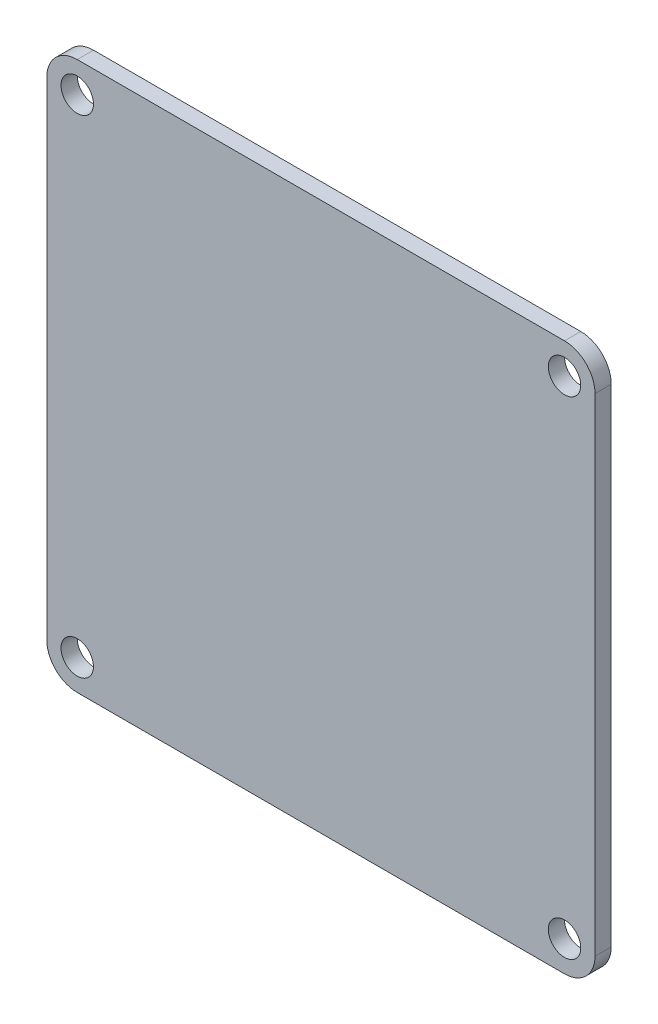
ISO-10303-21;
HEADER;
FILE_DESCRIPTION(('STEP AP214'),'2;1');
FILE_NAME('part.step','',(''),(''),'','','');
FILE_SCHEMA(('AUTOMOTIVE_DESIGN { 1 0 10303 214 1 1 1 1 }'));
ENDSEC;
DATA;
#1=APPLICATION_CONTEXT('core data for automotive mechanical design processes');
#2=APPLICATION_PROTOCOL_DEFINITION('international standard','automotive_design',2000,#1);
#3=PRODUCT_CONTEXT('',#1,'mechanical');
#4=PRODUCT('Part','Part','',(#3));
#5=PRODUCT_RELATED_PRODUCT_CATEGORY('part','',(#4));
#6=PRODUCT_DEFINITION_FORMATION('','',#4);
#7=PRODUCT_DEFINITION_CONTEXT('part definition',#1,'design');
#8=PRODUCT_DEFINITION('design','',#6,#7);
#9=PRODUCT_DEFINITION_SHAPE('','',#8);
#10=(LENGTH_UNIT() NAMED_UNIT(*) SI_UNIT(.MILLI.,.METRE.));
#11=(NAMED_UNIT(*) PLANE_ANGLE_UNIT() SI_UNIT($,.RADIAN.));
#12=(NAMED_UNIT(*) SI_UNIT($,.STERADIAN.) SOLID_ANGLE_UNIT());
#13=UNCERTAINTY_MEASURE_WITH_UNIT(LENGTH_MEASURE(1.E-05),#10,'distance_accuracy_value','');
#14=(GEOMETRIC_REPRESENTATION_CONTEXT(3) GLOBAL_UNCERTAINTY_ASSIGNED_CONTEXT((#13)) GLOBAL_UNIT_ASSIGNED_CONTEXT((#10,
#11,#12)) REPRESENTATION_CONTEXT('',''));
#15=CARTESIAN_POINT('',(0.,0.,0.));
#16=DIRECTION('',(0.,0.,1.));
#17=DIRECTION('',(1.,0.,0.));
#18=AXIS2_PLACEMENT_3D('',#15,#16,#17);
#19=CARTESIAN_POINT('',(30.,30.,2.));
#20=DIRECTION('',(0.,0.,-1.));
#21=DIRECTION('',(-1.,0.,0.));
#22=AXIS2_PLACEMENT_3D('',#19,#20,#21);
#23=CYLINDRICAL_SURFACE('',#22,3.75000000000001);
#24=CARTESIAN_POINT('',(30.,30.,0.));
#25=DIRECTION('',(0.,0.,1.));
#26=DIRECTION('',(1.,0.,0.));
#27=AXIS2_PLACEMENT_3D('',#24,#25,#26);
#28=CIRCLE('',#27,3.75000000000001);
#29=CARTESIAN_POINT('',(30.,33.75,0.));
#30=VERTEX_POINT('',#29);
#31=CARTESIAN_POINT('',(33.75,30.,0.));
#32=VERTEX_POINT('',#31);
#33=EDGE_CURVE('E174',#30,#32,#28,.F.);
#34=ORIENTED_EDGE('',*,*,#33,.F.);
#35=DIRECTION('',(0.,0.,-1.));
#36=VECTOR('',#35,1.);
#37=CARTESIAN_POINT('',(30.,33.75,2.));
#38=LINE('',#37,#36);
#39=CARTESIAN_POINT('',(30.,33.75,2.));
#40=VERTEX_POINT('',#39);
#41=EDGE_CURVE('E11',#40,#30,#38,.T.);
#42=ORIENTED_EDGE('',*,*,#41,.F.);
#43=CARTESIAN_POINT('',(30.,30.,2.));
#44=DIRECTION('',(0.,0.,1.));
#45=DIRECTION('',(1.,0.,0.));
#46=AXIS2_PLACEMENT_3D('',#43,#44,#45);
#47=CIRCLE('',#46,3.75000000000001);
#48=CARTESIAN_POINT('',(33.75,30.,2.));
#49=VERTEX_POINT('',#48);
#50=EDGE_CURVE('E272',#40,#49,#47,.F.);
#51=ORIENTED_EDGE('',*,*,#50,.T.);
#52=DIRECTION('',(0.,0.,-1.));
#53=VECTOR('',#52,1.);
#54=CARTESIAN_POINT('',(33.75,30.,2.));
#55=LINE('',#54,#53);
#56=EDGE_CURVE('E61',#49,#32,#55,.T.);
#57=ORIENTED_EDGE('',*,*,#56,.T.);
#58=EDGE_LOOP('',(#34,#42,#51,#57));
#59=FACE_BOUND('',#58,.T.);
#60=ADVANCED_FACE('F43',(#59),#23,.T.);
#61=CARTESIAN_POINT('',(0.,33.75,2.));
#62=DIRECTION('',(0.,1.,0.));
#63=DIRECTION('',(-1.,0.,0.));
#64=AXIS2_PLACEMENT_3D('',#61,#62,#63);
#65=PLANE('',#64);
#66=DIRECTION('',(1.,0.,0.));
#67=VECTOR('',#66,1.);
#68=CARTESIAN_POINT('',(0.,33.75,0.));
#69=LINE('',#68,#67);
#70=CARTESIAN_POINT('',(-30.,33.75,0.));
#71=VERTEX_POINT('',#70);
#72=EDGE_CURVE('E166',#71,#30,#69,.T.);
#73=ORIENTED_EDGE('',*,*,#72,.F.);
#74=DIRECTION('',(0.,0.,-1.));
#75=VECTOR('',#74,1.);
#76=CARTESIAN_POINT('',(-30.,33.75,2.));
#77=LINE('',#76,#75);
#78=CARTESIAN_POINT('',(-30.,33.75,2.));
#79=VERTEX_POINT('',#78);
#80=EDGE_CURVE('E53',#79,#71,#77,.T.);
#81=ORIENTED_EDGE('',*,*,#80,.F.);
#82=DIRECTION('',(1.,0.,0.));
#83=VECTOR('',#82,1.);
#84=CARTESIAN_POINT('',(0.,33.75,2.));
#85=LINE('',#84,#83);
#86=EDGE_CURVE('E275',#79,#40,#85,.T.);
#87=ORIENTED_EDGE('',*,*,#86,.T.);
#88=ORIENTED_EDGE('',*,*,#41,.T.);
#89=EDGE_LOOP('',(#73,#81,#87,#88));
#90=FACE_BOUND('',#89,.T.);
#91=ADVANCED_FACE('F172',(#90),#65,.T.);
#92=CARTESIAN_POINT('',(-30.,30.,2.));
#93=DIRECTION('',(0.,0.,-1.));
#94=DIRECTION('',(-1.,0.,0.));
#95=AXIS2_PLACEMENT_3D('',#92,#93,#94);
#96=CYLINDRICAL_SURFACE('',#95,3.75000000000002);
#97=CARTESIAN_POINT('',(-30.,30.,0.));
#98=DIRECTION('',(0.,0.,1.));
#99=DIRECTION('',(1.,0.,0.));
#100=AXIS2_PLACEMENT_3D('',#97,#98,#99);
#101=CIRCLE('',#100,3.75000000000002);
#102=CARTESIAN_POINT('',(-33.75,30.,0.));
#103=VERTEX_POINT('',#102);
#104=EDGE_CURVE('E156',#71,#103,#101,.T.);
#105=ORIENTED_EDGE('',*,*,#104,.T.);
#106=DIRECTION('',(0.,0.,-1.));
#107=VECTOR('',#106,1.);
#108=CARTESIAN_POINT('',(-33.75,30.,2.));
#109=LINE('',#108,#107);
#110=CARTESIAN_POINT('',(-33.75,30.,2.));
#111=VERTEX_POINT('',#110);
#112=EDGE_CURVE('E146',#111,#103,#109,.T.);
#113=ORIENTED_EDGE('',*,*,#112,.F.);
#114=CARTESIAN_POINT('',(-30.,30.,2.));
#115=DIRECTION('',(0.,0.,1.));
#116=DIRECTION('',(1.,0.,0.));
#117=AXIS2_PLACEMENT_3D('',#114,#115,#116);
#118=CIRCLE('',#117,3.75000000000002);
#119=EDGE_CURVE('E158',#79,#111,#118,.T.);
#120=ORIENTED_EDGE('',*,*,#119,.F.);
#121=ORIENTED_EDGE('',*,*,#80,.T.);
#122=EDGE_LOOP('',(#105,#113,#120,#121));
#123=FACE_BOUND('',#122,.T.);
#124=ADVANCED_FACE('F154',(#123),#96,.T.);
#125=CARTESIAN_POINT('',(-33.75,0.,2.));
#126=DIRECTION('',(1.,0.,0.));
#127=DIRECTION('',(0.,1.,0.));
#128=AXIS2_PLACEMENT_3D('',#125,#126,#127);
#129=PLANE('',#128);
#130=DIRECTION('',(0.,-1.,0.));
#131=VECTOR('',#130,1.);
#132=CARTESIAN_POINT('',(-33.75,0.,0.));
#133=LINE('',#132,#131);
#134=CARTESIAN_POINT('',(-33.75,-30.,0.));
#135=VERTEX_POINT('',#134);
#136=EDGE_CURVE('E169',#103,#135,#133,.T.);
#137=ORIENTED_EDGE('',*,*,#136,.T.);
#138=DIRECTION('',(0.,0.,-1.));
#139=VECTOR('',#138,1.);
#140=CARTESIAN_POINT('',(-33.75,-30.,2.));
#141=LINE('',#140,#139);
#142=CARTESIAN_POINT('',(-33.75,-30.,2.));
#143=VERTEX_POINT('',#142);
#144=EDGE_CURVE('E139',#143,#135,#141,.T.);
#145=ORIENTED_EDGE('',*,*,#144,.F.);
#146=DIRECTION('',(0.,-1.,0.));
#147=VECTOR('',#146,1.);
#148=CARTESIAN_POINT('',(-33.75,0.,2.));
#149=LINE('',#148,#147);
#150=EDGE_CURVE('E280',#111,#143,#149,.T.);
#151=ORIENTED_EDGE('',*,*,#150,.F.);
#152=ORIENTED_EDGE('',*,*,#112,.T.);
#153=EDGE_LOOP('',(#137,#145,#151,#152));
#154=FACE_BOUND('',#153,.T.);
#155=ADVANCED_FACE('F298',(#154),#129,.F.);
#156=CARTESIAN_POINT('',(-30.,-30.,2.));
#157=DIRECTION('',(0.,0.,-1.));
#158=DIRECTION('',(-1.,0.,0.));
#159=AXIS2_PLACEMENT_3D('',#156,#157,#158);
#160=CYLINDRICAL_SURFACE('',#159,3.75000000000001);
#161=CARTESIAN_POINT('',(-30.,-30.,0.));
#162=DIRECTION('',(0.,0.,1.));
#163=DIRECTION('',(1.,0.,0.));
#164=AXIS2_PLACEMENT_3D('',#161,#162,#163);
#165=CIRCLE('',#164,3.75000000000001);
#166=CARTESIAN_POINT('',(-30.,-33.75,0.));
#167=VERTEX_POINT('',#166);
#168=EDGE_CURVE('E183',#167,#135,#165,.F.);
#169=ORIENTED_EDGE('',*,*,#168,.F.);
#170=DIRECTION('',(0.,0.,-1.));
#171=VECTOR('',#170,1.);
#172=CARTESIAN_POINT('',(-30.,-33.75,2.));
#173=LINE('',#172,#171);
#174=CARTESIAN_POINT('',(-30.,-33.75,2.));
#175=VERTEX_POINT('',#174);
#176=EDGE_CURVE('E135',#175,#167,#173,.T.);
#177=ORIENTED_EDGE('',*,*,#176,.F.);
#178=CARTESIAN_POINT('',(-30.,-30.,2.));
#179=DIRECTION('',(0.,0.,1.));
#180=DIRECTION('',(1.,0.,0.));
#181=AXIS2_PLACEMENT_3D('',#178,#179,#180);
#182=CIRCLE('',#181,3.75000000000001);
#183=EDGE_CURVE('E127',#175,#143,#182,.F.);
#184=ORIENTED_EDGE('',*,*,#183,.T.);
#185=ORIENTED_EDGE('',*,*,#144,.T.);
#186=EDGE_LOOP('',(#169,#177,#184,#185));
#187=FACE_BOUND('',#186,.T.);
#188=ADVANCED_FACE('F286',(#187),#160,.T.);
#189=CARTESIAN_POINT('',(0.,-33.75,2.));
#190=DIRECTION('',(0.,1.,0.));
#191=DIRECTION('',(0.,0.,1.));
#192=AXIS2_PLACEMENT_3D('',#189,#190,#191);
#193=PLANE('',#192);
#194=DIRECTION('',(1.,0.,0.));
#195=VECTOR('',#194,1.);
#196=CARTESIAN_POINT('',(0.,-33.75,0.));
#197=LINE('',#196,#195);
#198=CARTESIAN_POINT('',(30.,-33.75,0.));
#199=VERTEX_POINT('',#198);
#200=EDGE_CURVE('E133',#167,#199,#197,.T.);
#201=ORIENTED_EDGE('',*,*,#200,.T.);
#202=DIRECTION('',(0.,0.,-1.));
#203=VECTOR('',#202,1.);
#204=CARTESIAN_POINT('',(30.,-33.75,2.));
#205=LINE('',#204,#203);
#206=CARTESIAN_POINT('',(30.,-33.75,2.));
#207=VERTEX_POINT('',#206);
#208=EDGE_CURVE('E115',#207,#199,#205,.T.);
#209=ORIENTED_EDGE('',*,*,#208,.F.);
#210=DIRECTION('',(1.,0.,0.));
#211=VECTOR('',#210,1.);
#212=CARTESIAN_POINT('',(0.,-33.75,2.));
#213=LINE('',#212,#211);
#214=EDGE_CURVE('E121',#175,#207,#213,.T.);
#215=ORIENTED_EDGE('',*,*,#214,.F.);
#216=ORIENTED_EDGE('',*,*,#176,.T.);
#217=EDGE_LOOP('',(#201,#209,#215,#216));
#218=FACE_BOUND('',#217,.T.);
#219=ADVANCED_FACE('F131',(#218),#193,.F.);
#220=CARTESIAN_POINT('',(30.,-30.,2.));
#221=DIRECTION('',(0.,0.,-1.));
#222=DIRECTION('',(-1.,0.,0.));
#223=AXIS2_PLACEMENT_3D('',#220,#221,#222);
#224=CYLINDRICAL_SURFACE('',#223,3.75000000000001);
#225=CARTESIAN_POINT('',(30.,-30.,0.));
#226=DIRECTION('',(0.,0.,1.));
#227=DIRECTION('',(1.,0.,0.));
#228=AXIS2_PLACEMENT_3D('',#225,#226,#227);
#229=CIRCLE('',#228,3.75000000000001);
#230=CARTESIAN_POINT('',(33.75,-30.,0.));
#231=VERTEX_POINT('',#230);
#232=EDGE_CURVE('E188',#199,#231,#229,.T.);
#233=ORIENTED_EDGE('',*,*,#232,.T.);
#234=DIRECTION('',(0.,0.,-1.));
#235=VECTOR('',#234,1.);
#236=CARTESIAN_POINT('',(33.75,-30.,2.));
#237=LINE('',#236,#235);
#238=CARTESIAN_POINT('',(33.75,-30.,2.));
#239=VERTEX_POINT('',#238);
#240=EDGE_CURVE('E87',#239,#231,#237,.T.);
#241=ORIENTED_EDGE('',*,*,#240,.F.);
#242=CARTESIAN_POINT('',(30.,-30.,2.));
#243=DIRECTION('',(0.,0.,1.));
#244=DIRECTION('',(1.,0.,0.));
#245=AXIS2_PLACEMENT_3D('',#242,#243,#244);
#246=CIRCLE('',#245,3.75000000000001);
#247=EDGE_CURVE('E111',#207,#239,#246,.T.);
#248=ORIENTED_EDGE('',*,*,#247,.F.);
#249=ORIENTED_EDGE('',*,*,#208,.T.);
#250=EDGE_LOOP('',(#233,#241,#248,#249));
#251=FACE_BOUND('',#250,.T.);
#252=ADVANCED_FACE('F113',(#251),#224,.T.);
#253=CARTESIAN_POINT('',(-30.,-30.,2.));
#254=DIRECTION('',(0.,0.,-1.));
#255=DIRECTION('',(-1.,0.,0.));
#256=AXIS2_PLACEMENT_3D('',#253,#254,#255);
#257=CYLINDRICAL_SURFACE('',#256,1.99739861189513);
#258=CARTESIAN_POINT('',(-30.,-30.,2.));
#259=DIRECTION('',(0.,0.,1.));
#260=DIRECTION('',(1.,0.,0.));
#261=AXIS2_PLACEMENT_3D('',#258,#259,#260);
#262=CIRCLE('',#261,1.99739861189513);
#263=CARTESIAN_POINT('',(-28.0026013881049,-30.,2.));
#264=VERTEX_POINT('',#263);
#265=EDGE_CURVE('E264',#264,#264,#262,.F.);
#266=ORIENTED_EDGE('',*,*,#265,.F.);
#267=EDGE_LOOP('',(#266));
#268=FACE_BOUND('',#267,.T.);
#269=CARTESIAN_POINT('',(-30.,-30.,0.));
#270=DIRECTION('',(0.,0.,1.));
#271=DIRECTION('',(1.,0.,0.));
#272=AXIS2_PLACEMENT_3D('',#269,#270,#271);
#273=CIRCLE('',#272,1.99739861189513);
#274=CARTESIAN_POINT('',(-28.0026013881049,-30.,0.));
#275=VERTEX_POINT('',#274);
#276=EDGE_CURVE('E177',#275,#275,#273,.F.);
#277=ORIENTED_EDGE('',*,*,#276,.T.);
#278=EDGE_LOOP('',(#277));
#279=FACE_BOUND('',#278,.T.);
#280=ADVANCED_FACE('F214',(#268,#279),#257,.F.);
#281=CARTESIAN_POINT('',(-30.,30.,2.));
#282=DIRECTION('',(0.,0.,-1.));
#283=DIRECTION('',(-1.,0.,0.));
#284=AXIS2_PLACEMENT_3D('',#281,#282,#283);
#285=CYLINDRICAL_SURFACE('',#284,1.99739861189515);
#286=CARTESIAN_POINT('',(-30.,30.,2.));
#287=DIRECTION('',(0.,0.,1.));
#288=DIRECTION('',(1.,0.,0.));
#289=AXIS2_PLACEMENT_3D('',#286,#287,#288);
#290=CIRCLE('',#289,1.99739861189515);
#291=CARTESIAN_POINT('',(-28.0026013881048,30.,2.));
#292=VERTEX_POINT('',#291);
#293=EDGE_CURVE('E259',#292,#292,#290,.T.);
#294=ORIENTED_EDGE('',*,*,#293,.T.);
#295=EDGE_LOOP('',(#294));
#296=FACE_BOUND('',#295,.T.);
#297=CARTESIAN_POINT('',(-30.,30.,0.));
#298=DIRECTION('',(0.,0.,1.));
#299=DIRECTION('',(1.,0.,0.));
#300=AXIS2_PLACEMENT_3D('',#297,#298,#299);
#301=CIRCLE('',#300,1.99739861189515);
#302=CARTESIAN_POINT('',(-28.0026013881048,30.,0.));
#303=VERTEX_POINT('',#302);
#304=EDGE_CURVE('E207',#303,#303,#301,.T.);
#305=ORIENTED_EDGE('',*,*,#304,.F.);
#306=EDGE_LOOP('',(#305));
#307=FACE_BOUND('',#306,.T.);
#308=ADVANCED_FACE('F238',(#296,#307),#285,.F.);
#309=CARTESIAN_POINT('',(30.,-30.,2.));
#310=DIRECTION('',(0.,0.,-1.));
#311=DIRECTION('',(-1.,0.,0.));
#312=AXIS2_PLACEMENT_3D('',#309,#310,#311);
#313=CYLINDRICAL_SURFACE('',#312,1.99739861189514);
#314=CARTESIAN_POINT('',(30.,-30.,2.));
#315=DIRECTION('',(0.,0.,1.));
#316=DIRECTION('',(1.,0.,0.));
#317=AXIS2_PLACEMENT_3D('',#314,#315,#316);
#318=CIRCLE('',#317,1.99739861189514);
#319=CARTESIAN_POINT('',(31.9973986118952,-30.,2.));
#320=VERTEX_POINT('',#319);
#321=EDGE_CURVE('E252',#320,#320,#318,.T.);
#322=ORIENTED_EDGE('',*,*,#321,.T.);
#323=EDGE_LOOP('',(#322));
#324=FACE_BOUND('',#323,.T.);
#325=CARTESIAN_POINT('',(30.,-30.,0.));
#326=DIRECTION('',(0.,0.,1.));
#327=DIRECTION('',(1.,0.,0.));
#328=AXIS2_PLACEMENT_3D('',#325,#326,#327);
#329=CIRCLE('',#328,1.99739861189514);
#330=CARTESIAN_POINT('',(31.9973986118952,-30.,0.));
#331=VERTEX_POINT('',#330);
#332=EDGE_CURVE('E203',#331,#331,#329,.T.);
#333=ORIENTED_EDGE('',*,*,#332,.F.);
#334=EDGE_LOOP('',(#333));
#335=FACE_BOUND('',#334,.T.);
#336=ADVANCED_FACE('F241',(#324,#335),#313,.F.);
#337=CARTESIAN_POINT('',(30.,30.,2.));
#338=DIRECTION('',(0.,0.,-1.));
#339=DIRECTION('',(-1.,0.,0.));
#340=AXIS2_PLACEMENT_3D('',#337,#338,#339);
#341=CYLINDRICAL_SURFACE('',#340,1.99739861189515);
#342=CARTESIAN_POINT('',(30.,30.,2.));
#343=DIRECTION('',(0.,0.,1.));
#344=DIRECTION('',(1.,0.,0.));
#345=AXIS2_PLACEMENT_3D('',#342,#343,#344);
#346=CIRCLE('',#345,1.99739861189515);
#347=CARTESIAN_POINT('',(31.9973986118952,30.,2.));
#348=VERTEX_POINT('',#347);
#349=EDGE_CURVE('E194',#348,#348,#346,.F.);
#350=ORIENTED_EDGE('',*,*,#349,.F.);
#351=EDGE_LOOP('',(#350));
#352=FACE_BOUND('',#351,.T.);
#353=CARTESIAN_POINT('',(30.,30.,0.));
#354=DIRECTION('',(0.,0.,1.));
#355=DIRECTION('',(1.,0.,0.));
#356=AXIS2_PLACEMENT_3D('',#353,#354,#355);
#357=CIRCLE('',#356,1.99739861189515);
#358=CARTESIAN_POINT('',(31.9973986118952,30.,0.));
#359=VERTEX_POINT('',#358);
#360=EDGE_CURVE('E199',#359,#359,#357,.F.);
#361=ORIENTED_EDGE('',*,*,#360,.T.);
#362=EDGE_LOOP('',(#361));
#363=FACE_BOUND('',#362,.T.);
#364=ADVANCED_FACE('F45',(#352,#363),#341,.F.);
#365=CARTESIAN_POINT('',(33.75,0.,2.));
#366=DIRECTION('',(1.,0.,0.));
#367=DIRECTION('',(0.,1.,0.));
#368=AXIS2_PLACEMENT_3D('',#365,#366,#367);
#369=PLANE('',#368);
#370=DIRECTION('',(0.,-1.,0.));
#371=VECTOR('',#370,1.);
#372=CARTESIAN_POINT('',(33.75,0.,0.));
#373=LINE('',#372,#371);
#374=EDGE_CURVE('E191',#32,#231,#373,.T.);
#375=ORIENTED_EDGE('',*,*,#374,.F.);
#376=ORIENTED_EDGE('',*,*,#56,.F.);
#377=DIRECTION('',(0.,-1.,0.));
#378=VECTOR('',#377,1.);
#379=CARTESIAN_POINT('',(33.75,0.,2.));
#380=LINE('',#379,#378);
#381=EDGE_CURVE('E120',#49,#239,#380,.T.);
#382=ORIENTED_EDGE('',*,*,#381,.T.);
#383=ORIENTED_EDGE('',*,*,#240,.T.);
#384=EDGE_LOOP('',(#375,#376,#382,#383));
#385=FACE_BOUND('',#384,.T.);
#386=ADVANCED_FACE('F222',(#385),#369,.T.);
#387=CARTESIAN_POINT('',(0.,0.,2.));
#388=DIRECTION('',(0.,0.,1.));
#389=DIRECTION('',(1.,0.,0.));
#390=AXIS2_PLACEMENT_3D('',#387,#388,#389);
#391=PLANE('',#390);
#392=ORIENTED_EDGE('',*,*,#349,.T.);
#393=EDGE_LOOP('',(#392));
#394=FACE_BOUND('',#393,.T.);
#395=ORIENTED_EDGE('',*,*,#321,.F.);
#396=EDGE_LOOP('',(#395));
#397=FACE_BOUND('',#396,.T.);
#398=ORIENTED_EDGE('',*,*,#293,.F.);
#399=EDGE_LOOP('',(#398));
#400=FACE_BOUND('',#399,.T.);
#401=ORIENTED_EDGE('',*,*,#265,.T.);
#402=EDGE_LOOP('',(#401));
#403=FACE_BOUND('',#402,.T.);
#404=ORIENTED_EDGE('',*,*,#50,.F.);
#405=ORIENTED_EDGE('',*,*,#86,.F.);
#406=ORIENTED_EDGE('',*,*,#119,.T.);
#407=ORIENTED_EDGE('',*,*,#150,.T.);
#408=ORIENTED_EDGE('',*,*,#183,.F.);
#409=ORIENTED_EDGE('',*,*,#214,.T.);
#410=ORIENTED_EDGE('',*,*,#247,.T.);
#411=ORIENTED_EDGE('',*,*,#381,.F.);
#412=EDGE_LOOP('',(#404,#405,#406,#407,#408,#409,#410,#411));
#413=FACE_BOUND('',#412,.T.);
#414=ADVANCED_FACE('F125',(#394,#397,#400,#403,#413),#391,.T.);
#415=CARTESIAN_POINT('',(0.,0.,0.));
#416=DIRECTION('',(0.,0.,1.));
#417=DIRECTION('',(1.,0.,0.));
#418=AXIS2_PLACEMENT_3D('',#415,#416,#417);
#419=PLANE('',#418);
#420=ORIENTED_EDGE('',*,*,#360,.F.);
#421=EDGE_LOOP('',(#420));
#422=FACE_BOUND('',#421,.T.);
#423=ORIENTED_EDGE('',*,*,#332,.T.);
#424=EDGE_LOOP('',(#423));
#425=FACE_BOUND('',#424,.T.);
#426=ORIENTED_EDGE('',*,*,#304,.T.);
#427=EDGE_LOOP('',(#426));
#428=FACE_BOUND('',#427,.T.);
#429=ORIENTED_EDGE('',*,*,#276,.F.);
#430=EDGE_LOOP('',(#429));
#431=FACE_BOUND('',#430,.T.);
#432=ORIENTED_EDGE('',*,*,#33,.T.);
#433=ORIENTED_EDGE('',*,*,#374,.T.);
#434=ORIENTED_EDGE('',*,*,#232,.F.);
#435=ORIENTED_EDGE('',*,*,#200,.F.);
#436=ORIENTED_EDGE('',*,*,#168,.T.);
#437=ORIENTED_EDGE('',*,*,#136,.F.);
#438=ORIENTED_EDGE('',*,*,#104,.F.);
#439=ORIENTED_EDGE('',*,*,#72,.T.);
#440=EDGE_LOOP('',(#432,#433,#434,#435,#436,#437,#438,#439));
#441=FACE_BOUND('',#440,.T.);
#442=ADVANCED_FACE('F165',(#422,#425,#428,#431,#441),#419,.F.);
#443=CLOSED_SHELL('',(#60,#91,#124,#155,#188,#219,#252,#280,#308,#336,#364,#386,#414,#442));
#444=MANIFOLD_SOLID_BREP('B2',#443);
#445=ADVANCED_BREP_SHAPE_REPRESENTATION('',(#18,#444),#14);
#446=SHAPE_DEFINITION_REPRESENTATION(#9,#445);
ENDSEC;
END-ISO-10303-21;
